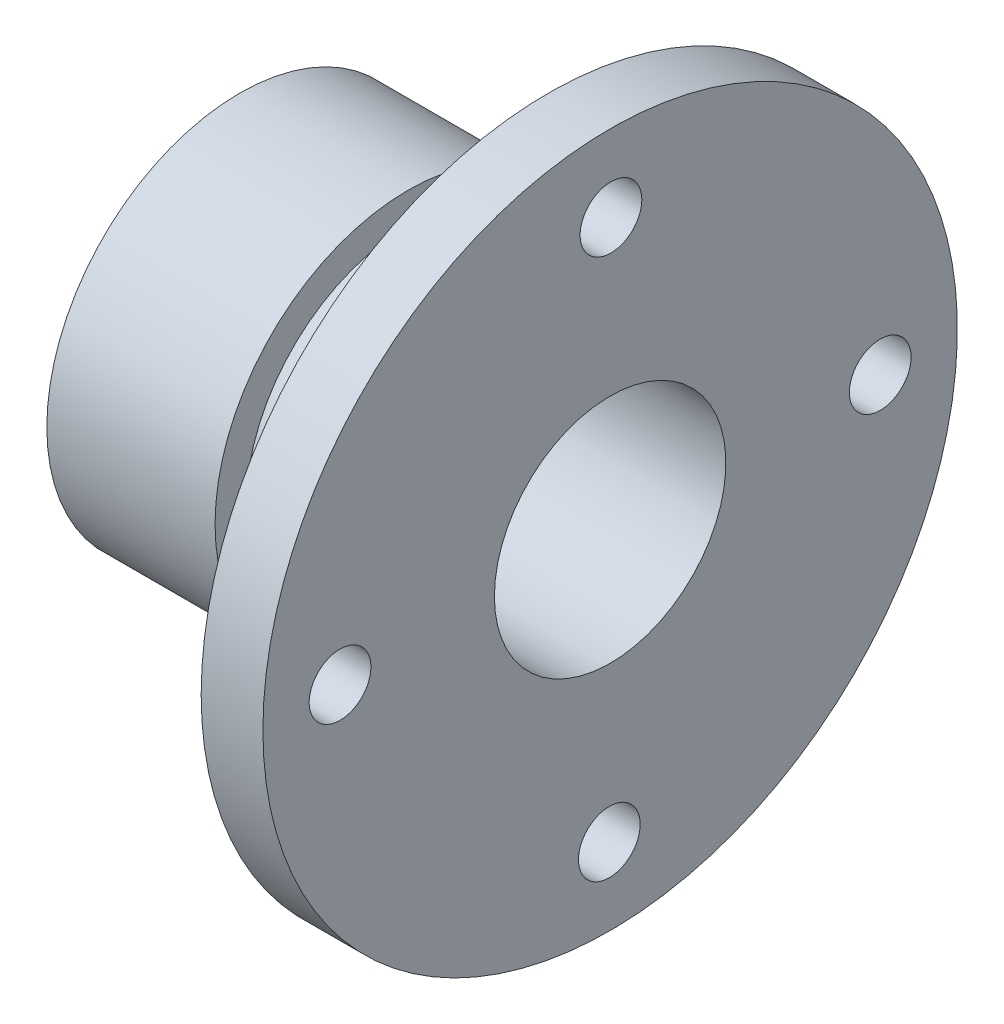
ISO-10303-21;
HEADER;
FILE_DESCRIPTION(('STEP AP214'),'2;1');
FILE_NAME('part.step','',(''),(''),'','','');
FILE_SCHEMA(('AUTOMOTIVE_DESIGN { 1 0 10303 214 1 1 1 1 }'));
ENDSEC;
DATA;
#1=APPLICATION_CONTEXT('core data for automotive mechanical design processes');
#2=APPLICATION_PROTOCOL_DEFINITION('international standard','automotive_design',2000,#1);
#3=PRODUCT_CONTEXT('',#1,'mechanical');
#4=PRODUCT('Part','Part','',(#3));
#5=PRODUCT_RELATED_PRODUCT_CATEGORY('part','',(#4));
#6=PRODUCT_DEFINITION_FORMATION('','',#4);
#7=PRODUCT_DEFINITION_CONTEXT('part definition',#1,'design');
#8=PRODUCT_DEFINITION('design','',#6,#7);
#9=PRODUCT_DEFINITION_SHAPE('','',#8);
#10=(LENGTH_UNIT() NAMED_UNIT(*) SI_UNIT(.MILLI.,.METRE.));
#11=(NAMED_UNIT(*) PLANE_ANGLE_UNIT() SI_UNIT($,.RADIAN.));
#12=(NAMED_UNIT(*) SI_UNIT($,.STERADIAN.) SOLID_ANGLE_UNIT());
#13=UNCERTAINTY_MEASURE_WITH_UNIT(LENGTH_MEASURE(1.E-05),#10,'distance_accuracy_value','');
#14=(GEOMETRIC_REPRESENTATION_CONTEXT(3) GLOBAL_UNCERTAINTY_ASSIGNED_CONTEXT((#13)) GLOBAL_UNIT_ASSIGNED_CONTEXT((#10,
#11,#12)) REPRESENTATION_CONTEXT('',''));
#15=CARTESIAN_POINT('',(0.,0.,0.));
#16=DIRECTION('',(0.,0.,1.));
#17=DIRECTION('',(1.,0.,0.));
#18=AXIS2_PLACEMENT_3D('',#15,#16,#17);
#19=CARTESIAN_POINT('',(10.0000001490116,0.,0.));
#20=DIRECTION('',(1.,0.,0.));
#21=DIRECTION('',(0.,0.,-1.));
#22=AXIS2_PLACEMENT_3D('',#19,#20,#21);
#23=CYLINDRICAL_SURFACE('',#22,12.5);
#24=DIRECTION('',(-1.,0.,0.));
#25=VECTOR('',#24,1.);
#26=CARTESIAN_POINT('',(10.0000001490116,0.,12.5));
#27=LINE('',#26,#25);
#28=CARTESIAN_POINT('',(10.9000002980232,0.,12.5));
#29=VERTEX_POINT('',#28);
#30=CARTESIAN_POINT('',(0.,0.,12.5));
#31=VERTEX_POINT('',#30);
#32=EDGE_CURVE('E127',#29,#31,#27,.T.);
#33=ORIENTED_EDGE('',*,*,#32,.F.);
#34=CARTESIAN_POINT('',(10.9000002980232,0.,0.));
#35=DIRECTION('',(-1.,0.,0.));
#36=DIRECTION('',(0.,0.,1.));
#37=AXIS2_PLACEMENT_3D('',#34,#35,#36);
#38=CIRCLE('',#37,12.5);
#39=EDGE_CURVE('E58',#29,#29,#38,.T.);
#40=ORIENTED_EDGE('',*,*,#39,.T.);
#41=ORIENTED_EDGE('',*,*,#32,.T.);
#42=CARTESIAN_POINT('',(0.,0.,0.));
#43=DIRECTION('',(1.,0.,0.));
#44=DIRECTION('',(0.,0.,-1.));
#45=AXIS2_PLACEMENT_3D('',#42,#43,#44);
#46=CIRCLE('',#45,12.5);
#47=EDGE_CURVE('E161',#31,#31,#46,.T.);
#48=ORIENTED_EDGE('',*,*,#47,.T.);
#49=EDGE_LOOP('',(#33,#40,#41,#48));
#50=FACE_BOUND('',#49,.T.);
#51=ADVANCED_FACE('F42',(#50),#23,.T.);
#52=CARTESIAN_POINT('',(20.0000002980232,0.,12.5));
#53=VERTEX_POINT('',#52);
#54=CARTESIAN_POINT('',(14.1000002980232,0.,12.5));
#55=VERTEX_POINT('',#54);
#56=EDGE_CURVE('E117',#53,#55,#27,.T.);
#57=ORIENTED_EDGE('',*,*,#56,.T.);
#58=CARTESIAN_POINT('',(14.1000002980232,0.,0.));
#59=DIRECTION('',(-1.,0.,0.));
#60=DIRECTION('',(0.,0.,1.));
#61=AXIS2_PLACEMENT_3D('',#58,#59,#60);
#62=CIRCLE('',#61,12.5);
#63=EDGE_CURVE('E63',#55,#55,#62,.T.);
#64=ORIENTED_EDGE('',*,*,#63,.F.);
#65=ORIENTED_EDGE('',*,*,#56,.F.);
#66=CARTESIAN_POINT('',(20.0000002980232,0.,0.));
#67=DIRECTION('',(1.,0.,0.));
#68=DIRECTION('',(0.,0.,-1.));
#69=AXIS2_PLACEMENT_3D('',#66,#67,#68);
#70=CIRCLE('',#69,12.5);
#71=EDGE_CURVE('E124',#53,#53,#70,.T.);
#72=ORIENTED_EDGE('',*,*,#71,.F.);
#73=EDGE_LOOP('',(#57,#64,#65,#72));
#74=FACE_BOUND('',#73,.T.);
#75=ADVANCED_FACE('F193',(#74),#23,.T.);
#76=CARTESIAN_POINT('',(0.,0.,-12.5));
#77=DIRECTION('',(-1.,0.,0.));
#78=DIRECTION('',(0.,0.,1.));
#79=AXIS2_PLACEMENT_3D('',#76,#77,#78);
#80=PLANE('',#79);
#81=CARTESIAN_POINT('',(0.,0.,0.));
#82=DIRECTION('',(1.,0.,0.));
#83=DIRECTION('',(0.,0.,-1.));
#84=AXIS2_PLACEMENT_3D('',#81,#82,#83);
#85=CIRCLE('',#84,7.5);
#86=CARTESIAN_POINT('',(0.,0.,7.5));
#87=VERTEX_POINT('',#86);
#88=EDGE_CURVE('E11',#87,#87,#85,.T.);
#89=ORIENTED_EDGE('',*,*,#88,.T.);
#90=EDGE_LOOP('',(#89));
#91=FACE_BOUND('',#90,.T.);
#92=ORIENTED_EDGE('',*,*,#47,.F.);
#93=EDGE_LOOP('',(#92));
#94=FACE_BOUND('',#93,.T.);
#95=ADVANCED_FACE('F199',(#91,#94),#80,.T.);
#96=CARTESIAN_POINT('',(12.,0.,0.));
#97=DIRECTION('',(1.,0.,0.));
#98=DIRECTION('',(0.,0.,-1.));
#99=AXIS2_PLACEMENT_3D('',#96,#97,#98);
#100=CYLINDRICAL_SURFACE('',#99,7.5);
#101=CARTESIAN_POINT('',(24.,0.,0.));
#102=DIRECTION('',(1.,0.,0.));
#103=DIRECTION('',(0.,0.,-1.));
#104=AXIS2_PLACEMENT_3D('',#101,#102,#103);
#105=CIRCLE('',#104,7.5);
#106=CARTESIAN_POINT('',(24.,0.,7.5));
#107=VERTEX_POINT('',#106);
#108=EDGE_CURVE('E109',#107,#107,#105,.T.);
#109=ORIENTED_EDGE('',*,*,#108,.T.);
#110=DIRECTION('',(-1.,0.,0.));
#111=VECTOR('',#110,1.);
#112=CARTESIAN_POINT('',(12.,0.,7.5));
#113=LINE('',#112,#111);
#114=EDGE_CURVE('E52',#107,#87,#113,.T.);
#115=ORIENTED_EDGE('',*,*,#114,.T.);
#116=ORIENTED_EDGE('',*,*,#88,.F.);
#117=ORIENTED_EDGE('',*,*,#114,.F.);
#118=EDGE_LOOP('',(#109,#115,#116,#117));
#119=FACE_BOUND('',#118,.T.);
#120=ADVANCED_FACE('F44',(#119),#100,.F.);
#121=CARTESIAN_POINT('',(24.,0.,-7.5));
#122=DIRECTION('',(1.,0.,0.));
#123=DIRECTION('',(0.,1.,0.));
#124=AXIS2_PLACEMENT_3D('',#121,#122,#123);
#125=PLANE('',#124);
#126=ORIENTED_EDGE('',*,*,#108,.F.);
#127=EDGE_LOOP('',(#126));
#128=FACE_BOUND('',#127,.T.);
#129=CARTESIAN_POINT('',(24.,17.4999111903367,-0.0534283305104789));
#130=DIRECTION('',(-1.,0.,0.));
#131=DIRECTION('',(0.,0.,1.));
#132=AXIS2_PLACEMENT_3D('',#129,#130,#131);
#133=CIRCLE('',#132,2.00000002980232);
#134=CARTESIAN_POINT('',(24.,17.4999111903367,-2.0534283603128));
#135=VERTEX_POINT('',#134);
#136=EDGE_CURVE('E128',#135,#135,#133,.T.);
#137=ORIENTED_EDGE('',*,*,#136,.T.);
#138=EDGE_LOOP('',(#137));
#139=FACE_BOUND('',#138,.T.);
#140=CARTESIAN_POINT('',(24.,0.0534283305104806,17.4999111903367));
#141=DIRECTION('',(-1.,0.,0.));
#142=DIRECTION('',(0.,0.,1.));
#143=AXIS2_PLACEMENT_3D('',#140,#141,#142);
#144=CIRCLE('',#143,2.00000002980232);
#145=CARTESIAN_POINT('',(24.,0.0534283305104804,15.4999111605344));
#146=VERTEX_POINT('',#145);
#147=EDGE_CURVE('E148',#146,#146,#144,.T.);
#148=ORIENTED_EDGE('',*,*,#147,.T.);
#149=EDGE_LOOP('',(#148));
#150=FACE_BOUND('',#149,.T.);
#151=CARTESIAN_POINT('',(24.,-0.0534283305104828,-17.4999111903367));
#152=DIRECTION('',(-1.,0.,0.));
#153=DIRECTION('',(0.,0.,1.));
#154=AXIS2_PLACEMENT_3D('',#151,#152,#153);
#155=CIRCLE('',#154,2.00000002980232);
#156=CARTESIAN_POINT('',(24.,-0.053428330510483,-19.499911220139));
#157=VERTEX_POINT('',#156);
#158=EDGE_CURVE('E123',#157,#157,#155,.T.);
#159=ORIENTED_EDGE('',*,*,#158,.T.);
#160=EDGE_LOOP('',(#159));
#161=FACE_BOUND('',#160,.T.);
#162=CARTESIAN_POINT('',(24.,-17.4999111903367,0.0534283305104867));
#163=DIRECTION('',(-1.,0.,0.));
#164=DIRECTION('',(0.,0.,1.));
#165=AXIS2_PLACEMENT_3D('',#162,#163,#164);
#166=CIRCLE('',#165,2.00000002980232);
#167=CARTESIAN_POINT('',(24.,-17.4999111903367,-1.94657169929184));
#168=VERTEX_POINT('',#167);
#169=EDGE_CURVE('E166',#168,#168,#166,.T.);
#170=ORIENTED_EDGE('',*,*,#169,.T.);
#171=EDGE_LOOP('',(#170));
#172=FACE_BOUND('',#171,.T.);
#173=CARTESIAN_POINT('',(24.,0.,0.));
#174=DIRECTION('',(1.,0.,0.));
#175=DIRECTION('',(0.,0.,-1.));
#176=AXIS2_PLACEMENT_3D('',#173,#174,#175);
#177=CIRCLE('',#176,22.5);
#178=CARTESIAN_POINT('',(24.,0.,22.5));
#179=VERTEX_POINT('',#178);
#180=EDGE_CURVE('E145',#179,#179,#177,.T.);
#181=ORIENTED_EDGE('',*,*,#180,.T.);
#182=EDGE_LOOP('',(#181));
#183=FACE_BOUND('',#182,.T.);
#184=ADVANCED_FACE('F205',(#128,#139,#150,#161,#172,#183),#125,.T.);
#185=CARTESIAN_POINT('',(22.0000001490116,0.,0.));
#186=DIRECTION('',(1.,0.,0.));
#187=DIRECTION('',(0.,0.,-1.));
#188=AXIS2_PLACEMENT_3D('',#185,#186,#187);
#189=CYLINDRICAL_SURFACE('',#188,22.5);
#190=ORIENTED_EDGE('',*,*,#180,.F.);
#191=DIRECTION('',(-1.,0.,0.));
#192=VECTOR('',#191,1.);
#193=CARTESIAN_POINT('',(22.0000001490116,0.,22.5));
#194=LINE('',#193,#192);
#195=CARTESIAN_POINT('',(20.0000002980232,0.,22.5));
#196=VERTEX_POINT('',#195);
#197=EDGE_CURVE('E113',#179,#196,#194,.T.);
#198=ORIENTED_EDGE('',*,*,#197,.T.);
#199=CARTESIAN_POINT('',(20.0000002980232,0.,0.));
#200=DIRECTION('',(1.,0.,0.));
#201=DIRECTION('',(0.,0.,-1.));
#202=AXIS2_PLACEMENT_3D('',#199,#200,#201);
#203=CIRCLE('',#202,22.5);
#204=EDGE_CURVE('E152',#196,#196,#203,.T.);
#205=ORIENTED_EDGE('',*,*,#204,.T.);
#206=ORIENTED_EDGE('',*,*,#197,.F.);
#207=EDGE_LOOP('',(#190,#198,#205,#206));
#208=FACE_BOUND('',#207,.T.);
#209=ADVANCED_FACE('F189',(#208),#189,.T.);
#210=CARTESIAN_POINT('',(20.0000002980232,0.,-22.5));
#211=DIRECTION('',(-1.,0.,0.));
#212=DIRECTION('',(0.,0.,1.));
#213=AXIS2_PLACEMENT_3D('',#210,#211,#212);
#214=PLANE('',#213);
#215=ORIENTED_EDGE('',*,*,#71,.T.);
#216=EDGE_LOOP('',(#215));
#217=FACE_BOUND('',#216,.T.);
#218=CARTESIAN_POINT('',(20.0000002980232,17.4999111903367,-0.0534283305104789));
#219=DIRECTION('',(1.,0.,0.));
#220=DIRECTION('',(0.,0.,1.));
#221=AXIS2_PLACEMENT_3D('',#218,#219,#220);
#222=CIRCLE('',#221,2.00000002980232);
#223=CARTESIAN_POINT('',(20.0000002980232,17.4999111903367,-2.0534283603128));
#224=VERTEX_POINT('',#223);
#225=EDGE_CURVE('E46',#224,#224,#222,.T.);
#226=ORIENTED_EDGE('',*,*,#225,.T.);
#227=EDGE_LOOP('',(#226));
#228=FACE_BOUND('',#227,.T.);
#229=CARTESIAN_POINT('',(20.0000002980232,0.0534283305104806,17.4999111903367));
#230=DIRECTION('',(1.,0.,0.));
#231=DIRECTION('',(0.,0.,1.));
#232=AXIS2_PLACEMENT_3D('',#229,#230,#231);
#233=CIRCLE('',#232,2.00000002980232);
#234=CARTESIAN_POINT('',(20.0000002980232,0.0534283305104804,15.4999111605344));
#235=VERTEX_POINT('',#234);
#236=EDGE_CURVE('E119',#235,#235,#233,.T.);
#237=ORIENTED_EDGE('',*,*,#236,.T.);
#238=EDGE_LOOP('',(#237));
#239=FACE_BOUND('',#238,.T.);
#240=CARTESIAN_POINT('',(20.0000002980232,-0.0534283305104828,-17.4999111903367));
#241=DIRECTION('',(1.,0.,0.));
#242=DIRECTION('',(0.,0.,1.));
#243=AXIS2_PLACEMENT_3D('',#240,#241,#242);
#244=CIRCLE('',#243,2.00000002980232);
#245=CARTESIAN_POINT('',(20.0000002980232,-0.053428330510483,-19.499911220139));
#246=VERTEX_POINT('',#245);
#247=EDGE_CURVE('E158',#246,#246,#244,.T.);
#248=ORIENTED_EDGE('',*,*,#247,.T.);
#249=EDGE_LOOP('',(#248));
#250=FACE_BOUND('',#249,.T.);
#251=CARTESIAN_POINT('',(20.0000002980232,-17.4999111903367,0.0534283305104867));
#252=DIRECTION('',(1.,0.,0.));
#253=DIRECTION('',(0.,0.,1.));
#254=AXIS2_PLACEMENT_3D('',#251,#252,#253);
#255=CIRCLE('',#254,2.00000002980232);
#256=CARTESIAN_POINT('',(20.0000002980232,-17.4999111903367,-1.94657169929184));
#257=VERTEX_POINT('',#256);
#258=EDGE_CURVE('E167',#257,#257,#255,.T.);
#259=ORIENTED_EDGE('',*,*,#258,.T.);
#260=EDGE_LOOP('',(#259));
#261=FACE_BOUND('',#260,.T.);
#262=ORIENTED_EDGE('',*,*,#204,.F.);
#263=EDGE_LOOP('',(#262));
#264=FACE_BOUND('',#263,.T.);
#265=ADVANCED_FACE('F175',(#217,#228,#239,#250,#261,#264),#214,.T.);
#266=CARTESIAN_POINT('',(20.0000002980232,17.4999111903367,-0.0534283305104789));
#267=DIRECTION('',(1.,0.,0.));
#268=DIRECTION('',(0.,0.,1.));
#269=AXIS2_PLACEMENT_3D('',#266,#267,#268);
#270=CYLINDRICAL_SURFACE('',#269,2.00000002980232);
#271=ORIENTED_EDGE('',*,*,#225,.F.);
#272=DIRECTION('',(1.,0.,0.));
#273=VECTOR('',#272,1.);
#274=CARTESIAN_POINT('',(20.0000002980232,17.4999111903367,-2.0534283603128));
#275=LINE('',#274,#273);
#276=EDGE_CURVE('E133',#224,#135,#275,.T.);
#277=ORIENTED_EDGE('',*,*,#276,.T.);
#278=ORIENTED_EDGE('',*,*,#136,.F.);
#279=ORIENTED_EDGE('',*,*,#276,.F.);
#280=EDGE_LOOP('',(#271,#277,#278,#279));
#281=FACE_BOUND('',#280,.T.);
#282=ADVANCED_FACE('F178',(#281),#270,.F.);
#283=CARTESIAN_POINT('',(20.0000002980232,0.0534283305104806,17.4999111903367));
#284=DIRECTION('',(1.,0.,0.));
#285=DIRECTION('',(0.,0.,1.));
#286=AXIS2_PLACEMENT_3D('',#283,#284,#285);
#287=CYLINDRICAL_SURFACE('',#286,2.00000002980232);
#288=ORIENTED_EDGE('',*,*,#236,.F.);
#289=DIRECTION('',(1.,0.,0.));
#290=VECTOR('',#289,1.);
#291=CARTESIAN_POINT('',(20.0000002980232,0.0534283305104809,15.4999111605344));
#292=LINE('',#291,#290);
#293=EDGE_CURVE('E122',#235,#146,#292,.T.);
#294=ORIENTED_EDGE('',*,*,#293,.T.);
#295=ORIENTED_EDGE('',*,*,#147,.F.);
#296=ORIENTED_EDGE('',*,*,#293,.F.);
#297=EDGE_LOOP('',(#288,#294,#295,#296));
#298=FACE_BOUND('',#297,.T.);
#299=ADVANCED_FACE('F180',(#298),#287,.F.);
#300=CARTESIAN_POINT('',(20.0000002980232,-0.0534283305104828,-17.4999111903367));
#301=DIRECTION('',(1.,0.,0.));
#302=DIRECTION('',(0.,0.,1.));
#303=AXIS2_PLACEMENT_3D('',#300,#301,#302);
#304=CYLINDRICAL_SURFACE('',#303,2.00000002980232);
#305=ORIENTED_EDGE('',*,*,#247,.F.);
#306=DIRECTION('',(1.,0.,0.));
#307=VECTOR('',#306,1.);
#308=CARTESIAN_POINT('',(20.0000002980232,-0.0534283305104825,-19.499911220139));
#309=LINE('',#308,#307);
#310=EDGE_CURVE('E154',#246,#157,#309,.T.);
#311=ORIENTED_EDGE('',*,*,#310,.T.);
#312=ORIENTED_EDGE('',*,*,#158,.F.);
#313=ORIENTED_EDGE('',*,*,#310,.F.);
#314=EDGE_LOOP('',(#305,#311,#312,#313));
#315=FACE_BOUND('',#314,.T.);
#316=ADVANCED_FACE('F186',(#315),#304,.F.);
#317=CARTESIAN_POINT('',(20.0000002980232,-17.4999111903367,0.0534283305104867));
#318=DIRECTION('',(1.,0.,0.));
#319=DIRECTION('',(0.,0.,1.));
#320=AXIS2_PLACEMENT_3D('',#317,#318,#319);
#321=CYLINDRICAL_SURFACE('',#320,2.00000002980232);
#322=ORIENTED_EDGE('',*,*,#258,.F.);
#323=DIRECTION('',(1.,0.,0.));
#324=VECTOR('',#323,1.);
#325=CARTESIAN_POINT('',(20.0000002980232,-17.4999111903367,-1.94657169929184));
#326=LINE('',#325,#324);
#327=EDGE_CURVE('E163',#257,#168,#326,.T.);
#328=ORIENTED_EDGE('',*,*,#327,.T.);
#329=ORIENTED_EDGE('',*,*,#169,.F.);
#330=ORIENTED_EDGE('',*,*,#327,.F.);
#331=EDGE_LOOP('',(#322,#328,#329,#330));
#332=FACE_BOUND('',#331,.T.);
#333=ADVANCED_FACE('F220',(#332),#321,.F.);
#334=CARTESIAN_POINT('',(10.9000002980232,10.5,0.));
#335=DIRECTION('',(1.,0.,0.));
#336=DIRECTION('',(0.,0.,-1.));
#337=AXIS2_PLACEMENT_3D('',#334,#335,#336);
#338=PLANE('',#337);
#339=CARTESIAN_POINT('',(10.9000002980232,0.,0.));
#340=DIRECTION('',(-1.,0.,0.));
#341=DIRECTION('',(0.,0.,1.));
#342=AXIS2_PLACEMENT_3D('',#339,#340,#341);
#343=CIRCLE('',#342,10.5);
#344=CARTESIAN_POINT('',(10.9000002980232,0.,10.5));
#345=VERTEX_POINT('',#344);
#346=EDGE_CURVE('E236',#345,#345,#343,.T.);
#347=ORIENTED_EDGE('',*,*,#346,.T.);
#348=EDGE_LOOP('',(#347));
#349=FACE_BOUND('',#348,.T.);
#350=ORIENTED_EDGE('',*,*,#39,.F.);
#351=EDGE_LOOP('',(#350));
#352=FACE_BOUND('',#351,.T.);
#353=ADVANCED_FACE('F222',(#349,#352),#338,.T.);
#354=CARTESIAN_POINT('',(0.,0.,0.));
#355=DIRECTION('',(-1.,0.,0.));
#356=DIRECTION('',(0.,0.,1.));
#357=AXIS2_PLACEMENT_3D('',#354,#355,#356);
#358=CYLINDRICAL_SURFACE('',#357,10.5);
#359=CARTESIAN_POINT('',(14.1000002980232,0.,0.));
#360=DIRECTION('',(-1.,0.,0.));
#361=DIRECTION('',(0.,0.,1.));
#362=AXIS2_PLACEMENT_3D('',#359,#360,#361);
#363=CIRCLE('',#362,10.5);
#364=CARTESIAN_POINT('',(14.1000002980232,0.,10.5));
#365=VERTEX_POINT('',#364);
#366=EDGE_CURVE('E240',#365,#365,#363,.T.);
#367=ORIENTED_EDGE('',*,*,#366,.T.);
#368=EDGE_LOOP('',(#367));
#369=FACE_BOUND('',#368,.T.);
#370=ORIENTED_EDGE('',*,*,#346,.F.);
#371=EDGE_LOOP('',(#370));
#372=FACE_BOUND('',#371,.T.);
#373=ADVANCED_FACE('F228',(#369,#372),#358,.T.);
#374=CARTESIAN_POINT('',(14.1000002980232,10.5,0.));
#375=DIRECTION('',(-1.,0.,0.));
#376=DIRECTION('',(0.,0.,1.));
#377=AXIS2_PLACEMENT_3D('',#374,#375,#376);
#378=PLANE('',#377);
#379=ORIENTED_EDGE('',*,*,#63,.T.);
#380=EDGE_LOOP('',(#379));
#381=FACE_BOUND('',#380,.T.);
#382=ORIENTED_EDGE('',*,*,#366,.F.);
#383=EDGE_LOOP('',(#382));
#384=FACE_BOUND('',#383,.T.);
#385=ADVANCED_FACE('F269',(#381,#384),#378,.T.);
#386=CLOSED_SHELL('',(#51,#75,#95,#120,#184,#209,#265,#282,#299,#316,#333,#353,#373,#385));
#387=MANIFOLD_SOLID_BREP('B2',#386);
#388=ADVANCED_BREP_SHAPE_REPRESENTATION('',(#18,#387),#14);
#389=SHAPE_DEFINITION_REPRESENTATION(#9,#388);
ENDSEC;
END-ISO-10303-21;
